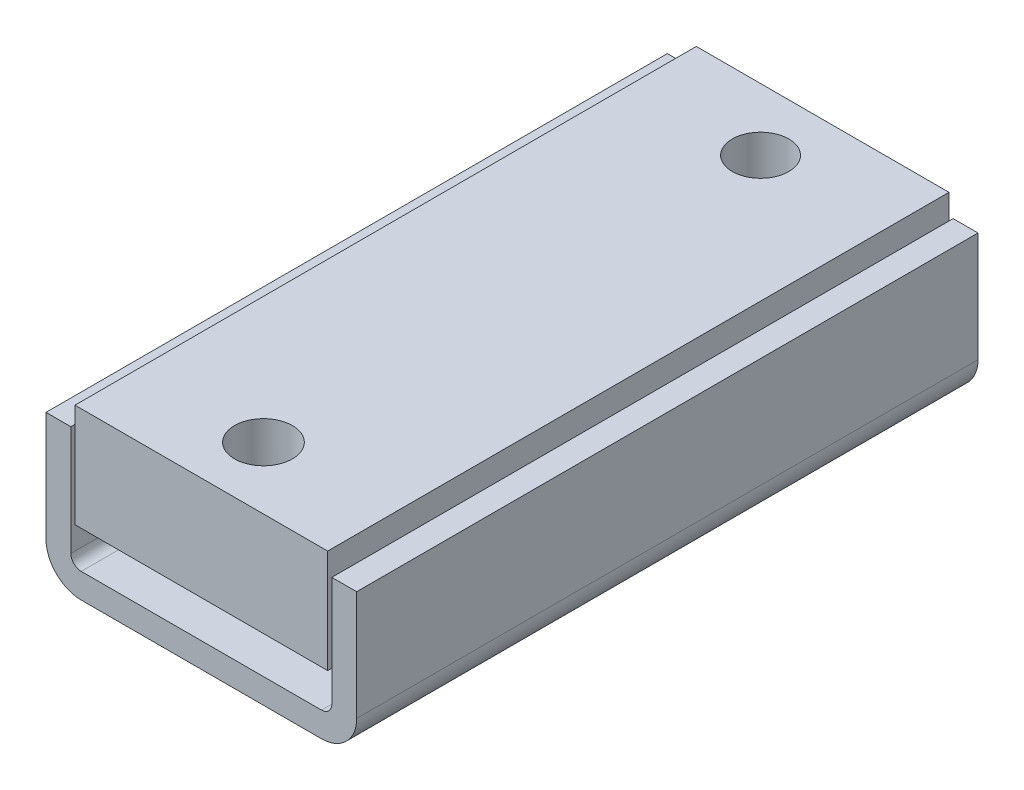
ISO-10303-21;
HEADER;
FILE_DESCRIPTION(('STEP AP214'),'2;1');
FILE_NAME('part.step','',(''),(''),'','','');
FILE_SCHEMA(('AUTOMOTIVE_DESIGN { 1 0 10303 214 1 1 1 1 }'));
ENDSEC;
DATA;
#1=APPLICATION_CONTEXT('core data for automotive mechanical design processes');
#2=APPLICATION_PROTOCOL_DEFINITION('international standard','automotive_design',2000,#1);
#3=PRODUCT_CONTEXT('',#1,'mechanical');
#4=PRODUCT('Part','Part','',(#3));
#5=PRODUCT_RELATED_PRODUCT_CATEGORY('part','',(#4));
#6=PRODUCT_DEFINITION_FORMATION('','',#4);
#7=PRODUCT_DEFINITION_CONTEXT('part definition',#1,'design');
#8=PRODUCT_DEFINITION('design','',#6,#7);
#9=PRODUCT_DEFINITION_SHAPE('','',#8);
#10=(LENGTH_UNIT() NAMED_UNIT(*) SI_UNIT(.MILLI.,.METRE.));
#11=(NAMED_UNIT(*) PLANE_ANGLE_UNIT() SI_UNIT($,.RADIAN.));
#12=(NAMED_UNIT(*) SI_UNIT($,.STERADIAN.) SOLID_ANGLE_UNIT());
#13=UNCERTAINTY_MEASURE_WITH_UNIT(LENGTH_MEASURE(1.E-05),#10,'distance_accuracy_value','');
#14=(GEOMETRIC_REPRESENTATION_CONTEXT(3) GLOBAL_UNCERTAINTY_ASSIGNED_CONTEXT((#13)) GLOBAL_UNIT_ASSIGNED_CONTEXT((#10,
#11,#12)) REPRESENTATION_CONTEXT('',''));
#15=CARTESIAN_POINT('',(0.,0.,0.));
#16=DIRECTION('',(0.,0.,1.));
#17=DIRECTION('',(1.,0.,0.));
#18=AXIS2_PLACEMENT_3D('',#15,#16,#17);
#19=CARTESIAN_POINT('',(1.4,8.,0.));
#20=DIRECTION('',(-1.,0.,0.));
#21=DIRECTION('',(0.,-1.,0.));
#22=AXIS2_PLACEMENT_3D('',#19,#20,#21);
#23=PLANE('',#22);
#24=DIRECTION('',(0.,-1.,0.));
#25=VECTOR('',#24,1.);
#26=CARTESIAN_POINT('',(1.4,8.,30.));
#27=LINE('',#26,#25);
#28=CARTESIAN_POINT('',(1.4,8.,30.));
#29=VERTEX_POINT('',#28);
#30=CARTESIAN_POINT('',(1.4,3.,30.));
#31=VERTEX_POINT('',#30);
#32=EDGE_CURVE('E107',#29,#31,#27,.T.);
#33=ORIENTED_EDGE('',*,*,#32,.F.);
#34=DIRECTION('',(0.,0.,1.));
#35=VECTOR('',#34,1.);
#36=CARTESIAN_POINT('',(1.4,8.,0.));
#37=LINE('',#36,#35);
#38=CARTESIAN_POINT('',(1.4,8.,0.));
#39=VERTEX_POINT('',#38);
#40=EDGE_CURVE('E12',#39,#29,#37,.T.);
#41=ORIENTED_EDGE('',*,*,#40,.F.);
#42=DIRECTION('',(0.,-1.,0.));
#43=VECTOR('',#42,1.);
#44=CARTESIAN_POINT('',(1.4,8.,0.));
#45=LINE('',#44,#43);
#46=CARTESIAN_POINT('',(1.4,3.,0.));
#47=VERTEX_POINT('',#46);
#48=EDGE_CURVE('E100',#39,#47,#45,.T.);
#49=ORIENTED_EDGE('',*,*,#48,.T.);
#50=DIRECTION('',(0.,0.,1.));
#51=VECTOR('',#50,1.);
#52=CARTESIAN_POINT('',(1.4,3.,0.));
#53=LINE('',#52,#51);
#54=EDGE_CURVE('E45',#47,#31,#53,.T.);
#55=ORIENTED_EDGE('',*,*,#54,.T.);
#56=EDGE_LOOP('',(#33,#41,#49,#55));
#57=FACE_BOUND('',#56,.T.);
#58=ADVANCED_FACE('F42',(#57),#23,.T.);
#59=CARTESIAN_POINT('',(1.4,8.,0.));
#60=DIRECTION('',(0.,1.,0.));
#61=DIRECTION('',(-1.,0.,0.));
#62=AXIS2_PLACEMENT_3D('',#59,#60,#61);
#63=PLANE('',#62);
#64=CARTESIAN_POINT('',(7.5,8.,3.));
#65=DIRECTION('',(0.,1.,0.));
#66=DIRECTION('',(-1.,0.,0.));
#67=AXIS2_PLACEMENT_3D('',#64,#65,#66);
#68=CIRCLE('',#67,1.36449120410503);
#69=CARTESIAN_POINT('',(6.13550879589497,8.,3.));
#70=VERTEX_POINT('',#69);
#71=EDGE_CURVE('E111',#70,#70,#68,.T.);
#72=ORIENTED_EDGE('',*,*,#71,.F.);
#73=EDGE_LOOP('',(#72));
#74=FACE_BOUND('',#73,.T.);
#75=CARTESIAN_POINT('',(7.5,8.,27.));
#76=DIRECTION('',(0.,1.,0.));
#77=DIRECTION('',(-1.,0.,0.));
#78=AXIS2_PLACEMENT_3D('',#75,#76,#77);
#79=CIRCLE('',#78,1.39655987582222);
#80=CARTESIAN_POINT('',(6.10344012417778,8.,27.));
#81=VERTEX_POINT('',#80);
#82=EDGE_CURVE('E144',#81,#81,#79,.T.);
#83=ORIENTED_EDGE('',*,*,#82,.F.);
#84=EDGE_LOOP('',(#83));
#85=FACE_BOUND('',#84,.T.);
#86=DIRECTION('',(-1.,0.,0.));
#87=VECTOR('',#86,1.);
#88=CARTESIAN_POINT('',(1.4,8.,30.));
#89=LINE('',#88,#87);
#90=CARTESIAN_POINT('',(13.6,8.,30.));
#91=VERTEX_POINT('',#90);
#92=EDGE_CURVE('E102',#91,#29,#89,.T.);
#93=ORIENTED_EDGE('',*,*,#92,.F.);
#94=DIRECTION('',(0.,0.,1.));
#95=VECTOR('',#94,1.);
#96=CARTESIAN_POINT('',(13.6,8.,0.));
#97=LINE('',#96,#95);
#98=CARTESIAN_POINT('',(13.6,8.,0.));
#99=VERTEX_POINT('',#98);
#100=EDGE_CURVE('E51',#99,#91,#97,.T.);
#101=ORIENTED_EDGE('',*,*,#100,.F.);
#102=DIRECTION('',(-1.,0.,0.));
#103=VECTOR('',#102,1.);
#104=CARTESIAN_POINT('',(1.4,8.,0.));
#105=LINE('',#104,#103);
#106=EDGE_CURVE('E97',#99,#39,#105,.T.);
#107=ORIENTED_EDGE('',*,*,#106,.T.);
#108=ORIENTED_EDGE('',*,*,#40,.T.);
#109=EDGE_LOOP('',(#93,#101,#107,#108));
#110=FACE_BOUND('',#109,.T.);
#111=ADVANCED_FACE('F118',(#74,#85,#110),#63,.T.);
#112=CARTESIAN_POINT('',(13.6,8.,0.));
#113=DIRECTION('',(1.,0.,0.));
#114=DIRECTION('',(0.,0.,-1.));
#115=AXIS2_PLACEMENT_3D('',#112,#113,#114);
#116=PLANE('',#115);
#117=DIRECTION('',(0.,1.,0.));
#118=VECTOR('',#117,1.);
#119=CARTESIAN_POINT('',(13.6,8.,30.));
#120=LINE('',#119,#118);
#121=CARTESIAN_POINT('',(13.6,3.,30.));
#122=VERTEX_POINT('',#121);
#123=EDGE_CURVE('E92',#122,#91,#120,.T.);
#124=ORIENTED_EDGE('',*,*,#123,.F.);
#125=DIRECTION('',(0.,0.,1.));
#126=VECTOR('',#125,1.);
#127=CARTESIAN_POINT('',(13.6,3.,0.));
#128=LINE('',#127,#126);
#129=CARTESIAN_POINT('',(13.6,3.,0.));
#130=VERTEX_POINT('',#129);
#131=EDGE_CURVE('E87',#130,#122,#128,.T.);
#132=ORIENTED_EDGE('',*,*,#131,.F.);
#133=DIRECTION('',(0.,1.,0.));
#134=VECTOR('',#133,1.);
#135=CARTESIAN_POINT('',(13.6,8.,0.));
#136=LINE('',#135,#134);
#137=EDGE_CURVE('E90',#130,#99,#136,.T.);
#138=ORIENTED_EDGE('',*,*,#137,.T.);
#139=ORIENTED_EDGE('',*,*,#100,.T.);
#140=EDGE_LOOP('',(#124,#132,#138,#139));
#141=FACE_BOUND('',#140,.T.);
#142=ADVANCED_FACE('F89',(#141),#116,.T.);
#143=CARTESIAN_POINT('',(1.4,3.,0.));
#144=DIRECTION('',(0.,-1.,0.));
#145=DIRECTION('',(1.,0.,0.));
#146=AXIS2_PLACEMENT_3D('',#143,#144,#145);
#147=PLANE('',#146);
#148=CARTESIAN_POINT('',(7.5,3.,3.));
#149=DIRECTION('',(0.,-1.,0.));
#150=DIRECTION('',(1.,0.,0.));
#151=AXIS2_PLACEMENT_3D('',#148,#149,#150);
#152=CIRCLE('',#151,1.36449120410503);
#153=CARTESIAN_POINT('',(8.86449120410504,3.,3.));
#154=VERTEX_POINT('',#153);
#155=EDGE_CURVE('E139',#154,#154,#152,.F.);
#156=ORIENTED_EDGE('',*,*,#155,.T.);
#157=EDGE_LOOP('',(#156));
#158=FACE_BOUND('',#157,.T.);
#159=CARTESIAN_POINT('',(7.5,3.,27.));
#160=DIRECTION('',(0.,-1.,0.));
#161=DIRECTION('',(1.,0.,0.));
#162=AXIS2_PLACEMENT_3D('',#159,#160,#161);
#163=CIRCLE('',#162,1.39655987582222);
#164=CARTESIAN_POINT('',(8.89655987582222,3.,27.));
#165=VERTEX_POINT('',#164);
#166=EDGE_CURVE('E142',#165,#165,#163,.F.);
#167=ORIENTED_EDGE('',*,*,#166,.T.);
#168=EDGE_LOOP('',(#167));
#169=FACE_BOUND('',#168,.T.);
#170=DIRECTION('',(1.,0.,0.));
#171=VECTOR('',#170,1.);
#172=CARTESIAN_POINT('',(1.4,3.,30.));
#173=LINE('',#172,#171);
#174=EDGE_CURVE('E110',#31,#122,#173,.T.);
#175=ORIENTED_EDGE('',*,*,#174,.F.);
#176=ORIENTED_EDGE('',*,*,#54,.F.);
#177=DIRECTION('',(1.,0.,0.));
#178=VECTOR('',#177,1.);
#179=CARTESIAN_POINT('',(1.4,3.,0.));
#180=LINE('',#179,#178);
#181=EDGE_CURVE('E96',#47,#130,#180,.T.);
#182=ORIENTED_EDGE('',*,*,#181,.T.);
#183=ORIENTED_EDGE('',*,*,#131,.T.);
#184=EDGE_LOOP('',(#175,#176,#182,#183));
#185=FACE_BOUND('',#184,.T.);
#186=ADVANCED_FACE('F99',(#158,#169,#185),#147,.T.);
#187=CARTESIAN_POINT('',(0.,0.,0.));
#188=DIRECTION('',(0.,0.,1.));
#189=DIRECTION('',(1.,0.,0.));
#190=AXIS2_PLACEMENT_3D('',#187,#188,#189);
#191=PLANE('',#190);
#192=ORIENTED_EDGE('',*,*,#48,.F.);
#193=ORIENTED_EDGE('',*,*,#106,.F.);
#194=ORIENTED_EDGE('',*,*,#137,.F.);
#195=ORIENTED_EDGE('',*,*,#181,.F.);
#196=EDGE_LOOP('',(#192,#193,#194,#195));
#197=FACE_BOUND('',#196,.T.);
#198=ADVANCED_FACE('F95',(#197),#191,.F.);
#199=CARTESIAN_POINT('',(0.,0.,30.));
#200=DIRECTION('',(0.,0.,1.));
#201=DIRECTION('',(1.,0.,0.));
#202=AXIS2_PLACEMENT_3D('',#199,#200,#201);
#203=PLANE('',#202);
#204=ORIENTED_EDGE('',*,*,#32,.T.);
#205=ORIENTED_EDGE('',*,*,#174,.T.);
#206=ORIENTED_EDGE('',*,*,#123,.T.);
#207=ORIENTED_EDGE('',*,*,#92,.T.);
#208=EDGE_LOOP('',(#204,#205,#206,#207));
#209=FACE_BOUND('',#208,.T.);
#210=ADVANCED_FACE('F117',(#209),#203,.T.);
#211=CARTESIAN_POINT('',(7.5,-0.001000000000001,27.));
#212=DIRECTION('',(0.,1.,0.));
#213=DIRECTION('',(-1.,0.,0.));
#214=AXIS2_PLACEMENT_3D('',#211,#212,#213);
#215=CYLINDRICAL_SURFACE('',#214,1.39655987582222);
#216=ORIENTED_EDGE('',*,*,#166,.F.);
#217=EDGE_LOOP('',(#216));
#218=FACE_BOUND('',#217,.T.);
#219=ORIENTED_EDGE('',*,*,#82,.T.);
#220=EDGE_LOOP('',(#219));
#221=FACE_BOUND('',#220,.T.);
#222=ADVANCED_FACE('F153',(#218,#221),#215,.F.);
#223=CARTESIAN_POINT('',(7.5,-0.001000000000001,3.));
#224=DIRECTION('',(0.,1.,0.));
#225=DIRECTION('',(-1.,0.,0.));
#226=AXIS2_PLACEMENT_3D('',#223,#224,#225);
#227=CYLINDRICAL_SURFACE('',#226,1.36449120410503);
#228=ORIENTED_EDGE('',*,*,#155,.F.);
#229=EDGE_LOOP('',(#228));
#230=FACE_BOUND('',#229,.T.);
#231=ORIENTED_EDGE('',*,*,#71,.T.);
#232=EDGE_LOOP('',(#231));
#233=FACE_BOUND('',#232,.T.);
#234=ADVANCED_FACE('F151',(#230,#233),#227,.F.);
#235=CLOSED_SHELL('',(#58,#111,#142,#186,#198,#210,#222,#234));
#236=MANIFOLD_SOLID_BREP('B2',#235);
#237=CARTESIAN_POINT('',(1.2,7.,30.));
#238=DIRECTION('',(0.,-1.,0.));
#239=DIRECTION('',(0.,0.,-1.));
#240=AXIS2_PLACEMENT_3D('',#237,#238,#239);
#241=PLANE('',#240);
#242=DIRECTION('',(-1.,0.,0.));
#243=VECTOR('',#242,1.);
#244=CARTESIAN_POINT('',(1.2,7.,0.));
#245=LINE('',#244,#243);
#246=CARTESIAN_POINT('',(1.2,7.,0.));
#247=VERTEX_POINT('',#246);
#248=CARTESIAN_POINT('',(0.,7.,0.));
#249=VERTEX_POINT('',#248);
#250=EDGE_CURVE('E316',#247,#249,#245,.T.);
#251=ORIENTED_EDGE('',*,*,#250,.T.);
#252=DIRECTION('',(0.,0.,-1.));
#253=VECTOR('',#252,1.);
#254=CARTESIAN_POINT('',(0.,7.,30.));
#255=LINE('',#254,#253);
#256=CARTESIAN_POINT('',(0.,7.,30.));
#257=VERTEX_POINT('',#256);
#258=EDGE_CURVE('E299',#257,#249,#255,.T.);
#259=ORIENTED_EDGE('',*,*,#258,.F.);
#260=DIRECTION('',(-1.,0.,0.));
#261=VECTOR('',#260,1.);
#262=CARTESIAN_POINT('',(1.2,7.,30.));
#263=LINE('',#262,#261);
#264=CARTESIAN_POINT('',(1.2,7.,30.));
#265=VERTEX_POINT('',#264);
#266=EDGE_CURVE('E304',#265,#257,#263,.T.);
#267=ORIENTED_EDGE('',*,*,#266,.F.);
#268=DIRECTION('',(0.,0.,-1.));
#269=VECTOR('',#268,1.);
#270=CARTESIAN_POINT('',(1.2,7.,30.));
#271=LINE('',#270,#269);
#272=EDGE_CURVE('E398',#265,#247,#271,.T.);
#273=ORIENTED_EDGE('',*,*,#272,.T.);
#274=EDGE_LOOP('',(#251,#259,#267,#273));
#275=FACE_BOUND('',#274,.T.);
#276=ADVANCED_FACE('F207',(#275),#241,.F.);
#277=CARTESIAN_POINT('',(0.,7.,30.));
#278=DIRECTION('',(1.,0.,0.));
#279=DIRECTION('',(0.,0.,-1.));
#280=AXIS2_PLACEMENT_3D('',#277,#278,#279);
#281=PLANE('',#280);
#282=DIRECTION('',(0.,-1.,0.));
#283=VECTOR('',#282,1.);
#284=CARTESIAN_POINT('',(0.,7.,0.));
#285=LINE('',#284,#283);
#286=CARTESIAN_POINT('',(0.,1.7,0.));
#287=VERTEX_POINT('',#286);
#288=EDGE_CURVE('E383',#249,#287,#285,.T.);
#289=ORIENTED_EDGE('',*,*,#288,.T.);
#290=DIRECTION('',(0.,0.,-1.));
#291=VECTOR('',#290,1.);
#292=CARTESIAN_POINT('',(0.,1.7,30.));
#293=LINE('',#292,#291);
#294=CARTESIAN_POINT('',(0.,1.7,30.));
#295=VERTEX_POINT('',#294);
#296=EDGE_CURVE('E40',#287,#295,#293,.F.);
#297=ORIENTED_EDGE('',*,*,#296,.T.);
#298=DIRECTION('',(0.,-1.,0.));
#299=VECTOR('',#298,1.);
#300=CARTESIAN_POINT('',(0.,7.,30.));
#301=LINE('',#300,#299);
#302=EDGE_CURVE('E295',#257,#295,#301,.T.);
#303=ORIENTED_EDGE('',*,*,#302,.F.);
#304=ORIENTED_EDGE('',*,*,#258,.T.);
#305=EDGE_LOOP('',(#289,#297,#303,#304));
#306=FACE_BOUND('',#305,.T.);
#307=ADVANCED_FACE('F297',(#306),#281,.F.);
#308=CARTESIAN_POINT('',(0.,0.,30.));
#309=DIRECTION('',(0.,1.,0.));
#310=DIRECTION('',(0.,0.,1.));
#311=AXIS2_PLACEMENT_3D('',#308,#309,#310);
#312=PLANE('',#311);
#313=CARTESIAN_POINT('',(7.5,0.,8.));
#314=DIRECTION('',(0.,-1.,0.));
#315=DIRECTION('',(0.,0.,-1.));
#316=AXIS2_PLACEMENT_3D('',#313,#314,#315);
#317=CIRCLE('',#316,1.5);
#318=CARTESIAN_POINT('',(7.5,0.,6.5));
#319=VERTEX_POINT('',#318);
#320=EDGE_CURVE('E333',#319,#319,#317,.T.);
#321=ORIENTED_EDGE('',*,*,#320,.F.);
#322=EDGE_LOOP('',(#321));
#323=FACE_BOUND('',#322,.T.);
#324=CARTESIAN_POINT('',(7.5,0.,22.));
#325=DIRECTION('',(0.,-1.,0.));
#326=DIRECTION('',(0.,0.,-1.));
#327=AXIS2_PLACEMENT_3D('',#324,#325,#326);
#328=CIRCLE('',#327,1.5);
#329=CARTESIAN_POINT('',(7.5,0.,20.5));
#330=VERTEX_POINT('',#329);
#331=EDGE_CURVE('E330',#330,#330,#328,.T.);
#332=ORIENTED_EDGE('',*,*,#331,.F.);
#333=EDGE_LOOP('',(#332));
#334=FACE_BOUND('',#333,.T.);
#335=DIRECTION('',(1.,0.,0.));
#336=VECTOR('',#335,1.);
#337=CARTESIAN_POINT('',(0.,0.,0.));
#338=LINE('',#337,#336);
#339=CARTESIAN_POINT('',(1.7,0.,0.));
#340=VERTEX_POINT('',#339);
#341=CARTESIAN_POINT('',(13.3,0.,0.));
#342=VERTEX_POINT('',#341);
#343=EDGE_CURVE('E378',#340,#342,#338,.T.);
#344=ORIENTED_EDGE('',*,*,#343,.T.);
#345=DIRECTION('',(0.,0.,-1.));
#346=VECTOR('',#345,1.);
#347=CARTESIAN_POINT('',(13.3,0.,30.));
#348=LINE('',#347,#346);
#349=CARTESIAN_POINT('',(13.3,0.,30.));
#350=VERTEX_POINT('',#349);
#351=EDGE_CURVE('E228',#342,#350,#348,.F.);
#352=ORIENTED_EDGE('',*,*,#351,.T.);
#353=DIRECTION('',(1.,0.,0.));
#354=VECTOR('',#353,1.);
#355=CARTESIAN_POINT('',(0.,0.,30.));
#356=LINE('',#355,#354);
#357=CARTESIAN_POINT('',(1.7,0.,30.));
#358=VERTEX_POINT('',#357);
#359=EDGE_CURVE('E303',#358,#350,#356,.T.);
#360=ORIENTED_EDGE('',*,*,#359,.F.);
#361=DIRECTION('',(0.,0.,-1.));
#362=VECTOR('',#361,1.);
#363=CARTESIAN_POINT('',(1.7,0.,30.));
#364=LINE('',#363,#362);
#365=EDGE_CURVE('E357',#358,#340,#364,.T.);
#366=ORIENTED_EDGE('',*,*,#365,.T.);
#367=EDGE_LOOP('',(#344,#352,#360,#366));
#368=FACE_BOUND('',#367,.T.);
#369=ADVANCED_FACE('F381',(#323,#334,#368),#312,.F.);
#370=CARTESIAN_POINT('',(15.,0.,30.));
#371=DIRECTION('',(-1.,0.,0.));
#372=DIRECTION('',(0.,0.,1.));
#373=AXIS2_PLACEMENT_3D('',#370,#371,#372);
#374=PLANE('',#373);
#375=DIRECTION('',(0.,1.,0.));
#376=VECTOR('',#375,1.);
#377=CARTESIAN_POINT('',(15.,0.,30.));
#378=LINE('',#377,#376);
#379=CARTESIAN_POINT('',(15.,1.7,30.));
#380=VERTEX_POINT('',#379);
#381=CARTESIAN_POINT('',(15.,7.,30.));
#382=VERTEX_POINT('',#381);
#383=EDGE_CURVE('E364',#380,#382,#378,.T.);
#384=ORIENTED_EDGE('',*,*,#383,.F.);
#385=DIRECTION('',(0.,0.,-1.));
#386=VECTOR('',#385,1.);
#387=CARTESIAN_POINT('',(15.,1.7,30.));
#388=LINE('',#387,#386);
#389=CARTESIAN_POINT('',(15.,1.7,0.));
#390=VERTEX_POINT('',#389);
#391=EDGE_CURVE('E350',#380,#390,#388,.T.);
#392=ORIENTED_EDGE('',*,*,#391,.T.);
#393=DIRECTION('',(0.,1.,0.));
#394=VECTOR('',#393,1.);
#395=CARTESIAN_POINT('',(15.,0.,0.));
#396=LINE('',#395,#394);
#397=CARTESIAN_POINT('',(15.,7.,0.));
#398=VERTEX_POINT('',#397);
#399=EDGE_CURVE('E380',#390,#398,#396,.T.);
#400=ORIENTED_EDGE('',*,*,#399,.T.);
#401=DIRECTION('',(0.,0.,-1.));
#402=VECTOR('',#401,1.);
#403=CARTESIAN_POINT('',(15.,7.,30.));
#404=LINE('',#403,#402);
#405=EDGE_CURVE('E318',#382,#398,#404,.T.);
#406=ORIENTED_EDGE('',*,*,#405,.F.);
#407=EDGE_LOOP('',(#384,#392,#400,#406));
#408=FACE_BOUND('',#407,.T.);
#409=ADVANCED_FACE('F369',(#408),#374,.F.);
#410=CARTESIAN_POINT('',(15.,7.,30.));
#411=DIRECTION('',(0.,-1.,0.));
#412=DIRECTION('',(0.,0.,-1.));
#413=AXIS2_PLACEMENT_3D('',#410,#411,#412);
#414=PLANE('',#413);
#415=DIRECTION('',(-1.,0.,0.));
#416=VECTOR('',#415,1.);
#417=CARTESIAN_POINT('',(15.,7.,0.));
#418=LINE('',#417,#416);
#419=CARTESIAN_POINT('',(13.8,7.,0.));
#420=VERTEX_POINT('',#419);
#421=EDGE_CURVE('E385',#398,#420,#418,.T.);
#422=ORIENTED_EDGE('',*,*,#421,.T.);
#423=DIRECTION('',(0.,0.,-1.));
#424=VECTOR('',#423,1.);
#425=CARTESIAN_POINT('',(13.8,7.,30.));
#426=LINE('',#425,#424);
#427=CARTESIAN_POINT('',(13.8,7.,30.));
#428=VERTEX_POINT('',#427);
#429=EDGE_CURVE('E323',#428,#420,#426,.T.);
#430=ORIENTED_EDGE('',*,*,#429,.F.);
#431=DIRECTION('',(-1.,0.,0.));
#432=VECTOR('',#431,1.);
#433=CARTESIAN_POINT('',(15.,7.,30.));
#434=LINE('',#433,#432);
#435=EDGE_CURVE('E372',#382,#428,#434,.T.);
#436=ORIENTED_EDGE('',*,*,#435,.F.);
#437=ORIENTED_EDGE('',*,*,#405,.T.);
#438=EDGE_LOOP('',(#422,#430,#436,#437));
#439=FACE_BOUND('',#438,.T.);
#440=ADVANCED_FACE('F456',(#439),#414,.F.);
#441=CARTESIAN_POINT('',(13.8,7.,30.));
#442=DIRECTION('',(1.,0.,0.));
#443=DIRECTION('',(0.,0.,-1.));
#444=AXIS2_PLACEMENT_3D('',#441,#442,#443);
#445=PLANE('',#444);
#446=DIRECTION('',(0.,-1.,0.));
#447=VECTOR('',#446,1.);
#448=CARTESIAN_POINT('',(13.8,7.,0.));
#449=LINE('',#448,#447);
#450=CARTESIAN_POINT('',(13.8,1.7,0.));
#451=VERTEX_POINT('',#450);
#452=EDGE_CURVE('E391',#420,#451,#449,.T.);
#453=ORIENTED_EDGE('',*,*,#452,.T.);
#454=DIRECTION('',(0.,0.,-1.));
#455=VECTOR('',#454,1.);
#456=CARTESIAN_POINT('',(13.8,1.7,30.));
#457=LINE('',#456,#455);
#458=CARTESIAN_POINT('',(13.8,1.7,30.));
#459=VERTEX_POINT('',#458);
#460=EDGE_CURVE('E337',#451,#459,#457,.F.);
#461=ORIENTED_EDGE('',*,*,#460,.T.);
#462=DIRECTION('',(0.,-1.,0.));
#463=VECTOR('',#462,1.);
#464=CARTESIAN_POINT('',(13.8,7.,30.));
#465=LINE('',#464,#463);
#466=EDGE_CURVE('E407',#428,#459,#465,.T.);
#467=ORIENTED_EDGE('',*,*,#466,.F.);
#468=ORIENTED_EDGE('',*,*,#429,.T.);
#469=EDGE_LOOP('',(#453,#461,#467,#468));
#470=FACE_BOUND('',#469,.T.);
#471=ADVANCED_FACE('F404',(#470),#445,.F.);
#472=CARTESIAN_POINT('',(13.8,1.2,30.));
#473=DIRECTION('',(0.,-1.,0.));
#474=DIRECTION('',(1.,0.,0.));
#475=AXIS2_PLACEMENT_3D('',#472,#473,#474);
#476=PLANE('',#475);
#477=CARTESIAN_POINT('',(7.5,1.2,8.));
#478=DIRECTION('',(0.,-1.,0.));
#479=DIRECTION('',(1.,0.,0.));
#480=AXIS2_PLACEMENT_3D('',#477,#478,#479);
#481=CIRCLE('',#480,1.5);
#482=CARTESIAN_POINT('',(9.,1.2,8.));
#483=VERTEX_POINT('',#482);
#484=EDGE_CURVE('E331',#483,#483,#481,.T.);
#485=ORIENTED_EDGE('',*,*,#484,.T.);
#486=EDGE_LOOP('',(#485));
#487=FACE_BOUND('',#486,.T.);
#488=CARTESIAN_POINT('',(7.5,1.2,22.));
#489=DIRECTION('',(0.,-1.,0.));
#490=DIRECTION('',(1.,0.,0.));
#491=AXIS2_PLACEMENT_3D('',#488,#489,#490);
#492=CIRCLE('',#491,1.5);
#493=CARTESIAN_POINT('',(9.,1.2,22.));
#494=VERTEX_POINT('',#493);
#495=EDGE_CURVE('E327',#494,#494,#492,.T.);
#496=ORIENTED_EDGE('',*,*,#495,.T.);
#497=EDGE_LOOP('',(#496));
#498=FACE_BOUND('',#497,.T.);
#499=DIRECTION('',(-1.,0.,0.));
#500=VECTOR('',#499,1.);
#501=CARTESIAN_POINT('',(13.8,1.2,30.));
#502=LINE('',#501,#500);
#503=CARTESIAN_POINT('',(13.3,1.2,30.));
#504=VERTEX_POINT('',#503);
#505=CARTESIAN_POINT('',(1.7,1.2,30.));
#506=VERTEX_POINT('',#505);
#507=EDGE_CURVE('E419',#504,#506,#502,.T.);
#508=ORIENTED_EDGE('',*,*,#507,.F.);
#509=DIRECTION('',(0.,0.,-1.));
#510=VECTOR('',#509,1.);
#511=CARTESIAN_POINT('',(13.3,1.2,0.));
#512=LINE('',#511,#510);
#513=CARTESIAN_POINT('',(13.3,1.2,0.));
#514=VERTEX_POINT('',#513);
#515=EDGE_CURVE('E320',#504,#514,#512,.T.);
#516=ORIENTED_EDGE('',*,*,#515,.T.);
#517=DIRECTION('',(-1.,0.,0.));
#518=VECTOR('',#517,1.);
#519=CARTESIAN_POINT('',(13.8,1.2,0.));
#520=LINE('',#519,#518);
#521=CARTESIAN_POINT('',(1.7,1.2,0.));
#522=VERTEX_POINT('',#521);
#523=EDGE_CURVE('E394',#514,#522,#520,.T.);
#524=ORIENTED_EDGE('',*,*,#523,.T.);
#525=DIRECTION('',(0.,0.,-1.));
#526=VECTOR('',#525,1.);
#527=CARTESIAN_POINT('',(1.7,1.2,30.));
#528=LINE('',#527,#526);
#529=EDGE_CURVE('E317',#522,#506,#528,.F.);
#530=ORIENTED_EDGE('',*,*,#529,.T.);
#531=EDGE_LOOP('',(#508,#516,#524,#530));
#532=FACE_BOUND('',#531,.T.);
#533=ADVANCED_FACE('F416',(#487,#498,#532),#476,.F.);
#534=CARTESIAN_POINT('',(1.2,1.2,30.));
#535=DIRECTION('',(-1.,0.,0.));
#536=DIRECTION('',(0.,0.,1.));
#537=AXIS2_PLACEMENT_3D('',#534,#535,#536);
#538=PLANE('',#537);
#539=DIRECTION('',(0.,1.,0.));
#540=VECTOR('',#539,1.);
#541=CARTESIAN_POINT('',(1.2,1.2,30.));
#542=LINE('',#541,#540);
#543=CARTESIAN_POINT('',(1.2,1.7,30.));
#544=VERTEX_POINT('',#543);
#545=EDGE_CURVE('E309',#544,#265,#542,.T.);
#546=ORIENTED_EDGE('',*,*,#545,.F.);
#547=DIRECTION('',(0.,0.,-1.));
#548=VECTOR('',#547,1.);
#549=CARTESIAN_POINT('',(1.2,1.7,0.));
#550=LINE('',#549,#548);
#551=CARTESIAN_POINT('',(1.2,1.7,0.));
#552=VERTEX_POINT('',#551);
#553=EDGE_CURVE('E339',#544,#552,#550,.T.);
#554=ORIENTED_EDGE('',*,*,#553,.T.);
#555=DIRECTION('',(0.,1.,0.));
#556=VECTOR('',#555,1.);
#557=CARTESIAN_POINT('',(1.2,1.2,0.));
#558=LINE('',#557,#556);
#559=EDGE_CURVE('E313',#552,#247,#558,.T.);
#560=ORIENTED_EDGE('',*,*,#559,.T.);
#561=ORIENTED_EDGE('',*,*,#272,.F.);
#562=EDGE_LOOP('',(#546,#554,#560,#561));
#563=FACE_BOUND('',#562,.T.);
#564=ADVANCED_FACE('F447',(#563),#538,.F.);
#565=CARTESIAN_POINT('',(0.,0.,30.));
#566=DIRECTION('',(0.,0.,1.));
#567=DIRECTION('',(1.,0.,0.));
#568=AXIS2_PLACEMENT_3D('',#565,#566,#567);
#569=PLANE('',#568);
#570=ORIENTED_EDGE('',*,*,#359,.T.);
#571=CARTESIAN_POINT('',(13.3,1.7,30.));
#572=DIRECTION('',(0.,0.,1.));
#573=DIRECTION('',(1.,0.,0.));
#574=AXIS2_PLACEMENT_3D('',#571,#572,#573);
#575=CIRCLE('',#574,1.7);
#576=EDGE_CURVE('E215',#350,#380,#575,.T.);
#577=ORIENTED_EDGE('',*,*,#576,.T.);
#578=ORIENTED_EDGE('',*,*,#383,.T.);
#579=ORIENTED_EDGE('',*,*,#435,.T.);
#580=ORIENTED_EDGE('',*,*,#466,.T.);
#581=CARTESIAN_POINT('',(13.3,1.7,30.));
#582=DIRECTION('',(0.,0.,1.));
#583=DIRECTION('',(1.,0.,0.));
#584=AXIS2_PLACEMENT_3D('',#581,#582,#583);
#585=CIRCLE('',#584,0.5);
#586=EDGE_CURVE('E344',#459,#504,#585,.F.);
#587=ORIENTED_EDGE('',*,*,#586,.T.);
#588=ORIENTED_EDGE('',*,*,#507,.T.);
#589=CARTESIAN_POINT('',(1.7,1.7,30.));
#590=DIRECTION('',(0.,0.,1.));
#591=DIRECTION('',(1.,0.,0.));
#592=AXIS2_PLACEMENT_3D('',#589,#590,#591);
#593=CIRCLE('',#592,0.5);
#594=EDGE_CURVE('E348',#506,#544,#593,.F.);
#595=ORIENTED_EDGE('',*,*,#594,.T.);
#596=ORIENTED_EDGE('',*,*,#545,.T.);
#597=ORIENTED_EDGE('',*,*,#266,.T.);
#598=ORIENTED_EDGE('',*,*,#302,.T.);
#599=CARTESIAN_POINT('',(1.7,1.7,30.));
#600=DIRECTION('',(0.,0.,1.));
#601=DIRECTION('',(1.,0.,0.));
#602=AXIS2_PLACEMENT_3D('',#599,#600,#601);
#603=CIRCLE('',#602,1.7);
#604=EDGE_CURVE('E361',#295,#358,#603,.T.);
#605=ORIENTED_EDGE('',*,*,#604,.T.);
#606=EDGE_LOOP('',(#570,#577,#578,#579,#580,#587,#588,#595,#596,#597,#598,#605));
#607=FACE_BOUND('',#606,.T.);
#608=ADVANCED_FACE('F307',(#607),#569,.T.);
#609=CARTESIAN_POINT('',(0.,0.,0.));
#610=DIRECTION('',(0.,0.,1.));
#611=DIRECTION('',(1.,0.,0.));
#612=AXIS2_PLACEMENT_3D('',#609,#610,#611);
#613=PLANE('',#612);
#614=ORIENTED_EDGE('',*,*,#399,.F.);
#615=CARTESIAN_POINT('',(13.3,1.7,0.));
#616=DIRECTION('',(0.,0.,1.));
#617=DIRECTION('',(1.,0.,0.));
#618=AXIS2_PLACEMENT_3D('',#615,#616,#617);
#619=CIRCLE('',#618,1.7);
#620=EDGE_CURVE('E355',#390,#342,#619,.F.);
#621=ORIENTED_EDGE('',*,*,#620,.T.);
#622=ORIENTED_EDGE('',*,*,#343,.F.);
#623=CARTESIAN_POINT('',(1.7,1.7,0.));
#624=DIRECTION('',(0.,0.,1.));
#625=DIRECTION('',(1.,0.,0.));
#626=AXIS2_PLACEMENT_3D('',#623,#624,#625);
#627=CIRCLE('',#626,1.7);
#628=EDGE_CURVE('E353',#340,#287,#627,.F.);
#629=ORIENTED_EDGE('',*,*,#628,.T.);
#630=ORIENTED_EDGE('',*,*,#288,.F.);
#631=ORIENTED_EDGE('',*,*,#250,.F.);
#632=ORIENTED_EDGE('',*,*,#559,.F.);
#633=CARTESIAN_POINT('',(1.7,1.7,0.));
#634=DIRECTION('',(0.,0.,1.));
#635=DIRECTION('',(1.,0.,0.));
#636=AXIS2_PLACEMENT_3D('',#633,#634,#635);
#637=CIRCLE('',#636,0.5);
#638=EDGE_CURVE('E346',#552,#522,#637,.T.);
#639=ORIENTED_EDGE('',*,*,#638,.T.);
#640=ORIENTED_EDGE('',*,*,#523,.F.);
#641=CARTESIAN_POINT('',(13.3,1.7,0.));
#642=DIRECTION('',(0.,0.,1.));
#643=DIRECTION('',(1.,0.,0.));
#644=AXIS2_PLACEMENT_3D('',#641,#642,#643);
#645=CIRCLE('',#644,0.5);
#646=EDGE_CURVE('E342',#514,#451,#645,.T.);
#647=ORIENTED_EDGE('',*,*,#646,.T.);
#648=ORIENTED_EDGE('',*,*,#452,.F.);
#649=ORIENTED_EDGE('',*,*,#421,.F.);
#650=EDGE_LOOP('',(#614,#621,#622,#629,#630,#631,#632,#639,#640,#647,#648,#649));
#651=FACE_BOUND('',#650,.T.);
#652=ADVANCED_FACE('F377',(#651),#613,.F.);
#653=CARTESIAN_POINT('',(7.5,7.,22.));
#654=DIRECTION('',(0.,-1.,0.));
#655=DIRECTION('',(0.,0.,-1.));
#656=AXIS2_PLACEMENT_3D('',#653,#654,#655);
#657=CYLINDRICAL_SURFACE('',#656,1.5);
#658=ORIENTED_EDGE('',*,*,#331,.T.);
#659=EDGE_LOOP('',(#658));
#660=FACE_BOUND('',#659,.T.);
#661=ORIENTED_EDGE('',*,*,#495,.F.);
#662=EDGE_LOOP('',(#661));
#663=FACE_BOUND('',#662,.T.);
#664=ADVANCED_FACE('F440',(#660,#663),#657,.F.);
#665=CARTESIAN_POINT('',(7.5,7.,8.));
#666=DIRECTION('',(0.,-1.,0.));
#667=DIRECTION('',(0.,0.,-1.));
#668=AXIS2_PLACEMENT_3D('',#665,#666,#667);
#669=CYLINDRICAL_SURFACE('',#668,1.5);
#670=ORIENTED_EDGE('',*,*,#320,.T.);
#671=EDGE_LOOP('',(#670));
#672=FACE_BOUND('',#671,.T.);
#673=ORIENTED_EDGE('',*,*,#484,.F.);
#674=EDGE_LOOP('',(#673));
#675=FACE_BOUND('',#674,.T.);
#676=ADVANCED_FACE('F432',(#672,#675),#669,.F.);
#677=CARTESIAN_POINT('',(13.3,1.7,30.));
#678=DIRECTION('',(0.,0.,1.));
#679=DIRECTION('',(1.,0.,0.));
#680=AXIS2_PLACEMENT_3D('',#677,#678,#679);
#681=CYLINDRICAL_SURFACE('',#680,0.5);
#682=ORIENTED_EDGE('',*,*,#586,.F.);
#683=ORIENTED_EDGE('',*,*,#460,.F.);
#684=ORIENTED_EDGE('',*,*,#646,.F.);
#685=ORIENTED_EDGE('',*,*,#515,.F.);
#686=EDGE_LOOP('',(#682,#683,#684,#685));
#687=FACE_BOUND('',#686,.T.);
#688=ADVANCED_FACE('F413',(#687),#681,.F.);
#689=CARTESIAN_POINT('',(1.7,1.7,30.));
#690=DIRECTION('',(0.,0.,1.));
#691=DIRECTION('',(1.,0.,0.));
#692=AXIS2_PLACEMENT_3D('',#689,#690,#691);
#693=CYLINDRICAL_SURFACE('',#692,0.5);
#694=ORIENTED_EDGE('',*,*,#594,.F.);
#695=ORIENTED_EDGE('',*,*,#529,.F.);
#696=ORIENTED_EDGE('',*,*,#638,.F.);
#697=ORIENTED_EDGE('',*,*,#553,.F.);
#698=EDGE_LOOP('',(#694,#695,#696,#697));
#699=FACE_BOUND('',#698,.T.);
#700=ADVANCED_FACE('F467',(#699),#693,.F.);
#701=CARTESIAN_POINT('',(13.3,1.7,30.));
#702=DIRECTION('',(0.,0.,-1.));
#703=DIRECTION('',(-1.,0.,0.));
#704=AXIS2_PLACEMENT_3D('',#701,#702,#703);
#705=CYLINDRICAL_SURFACE('',#704,1.7);
#706=ORIENTED_EDGE('',*,*,#576,.F.);
#707=ORIENTED_EDGE('',*,*,#351,.F.);
#708=ORIENTED_EDGE('',*,*,#620,.F.);
#709=ORIENTED_EDGE('',*,*,#391,.F.);
#710=EDGE_LOOP('',(#706,#707,#708,#709));
#711=FACE_BOUND('',#710,.T.);
#712=ADVANCED_FACE('F374',(#711),#705,.T.);
#713=CARTESIAN_POINT('',(1.7,1.7,30.));
#714=DIRECTION('',(0.,0.,-1.));
#715=DIRECTION('',(-1.,0.,0.));
#716=AXIS2_PLACEMENT_3D('',#713,#714,#715);
#717=CYLINDRICAL_SURFACE('',#716,1.7);
#718=ORIENTED_EDGE('',*,*,#604,.F.);
#719=ORIENTED_EDGE('',*,*,#296,.F.);
#720=ORIENTED_EDGE('',*,*,#628,.F.);
#721=ORIENTED_EDGE('',*,*,#365,.F.);
#722=EDGE_LOOP('',(#718,#719,#720,#721));
#723=FACE_BOUND('',#722,.T.);
#724=ADVANCED_FACE('F209',(#723),#717,.T.);
#725=CLOSED_SHELL('',(#276,#307,#369,#409,#440,#471,#533,#564,#608,#652,#664,#676,#688,#700,
#712,#724));
#726=MANIFOLD_SOLID_BREP('B6',#725);
#727=ADVANCED_BREP_SHAPE_REPRESENTATION('',(#18,#236,#726),#14);
#728=SHAPE_DEFINITION_REPRESENTATION(#9,#727);
ENDSEC;
END-ISO-10303-21;
